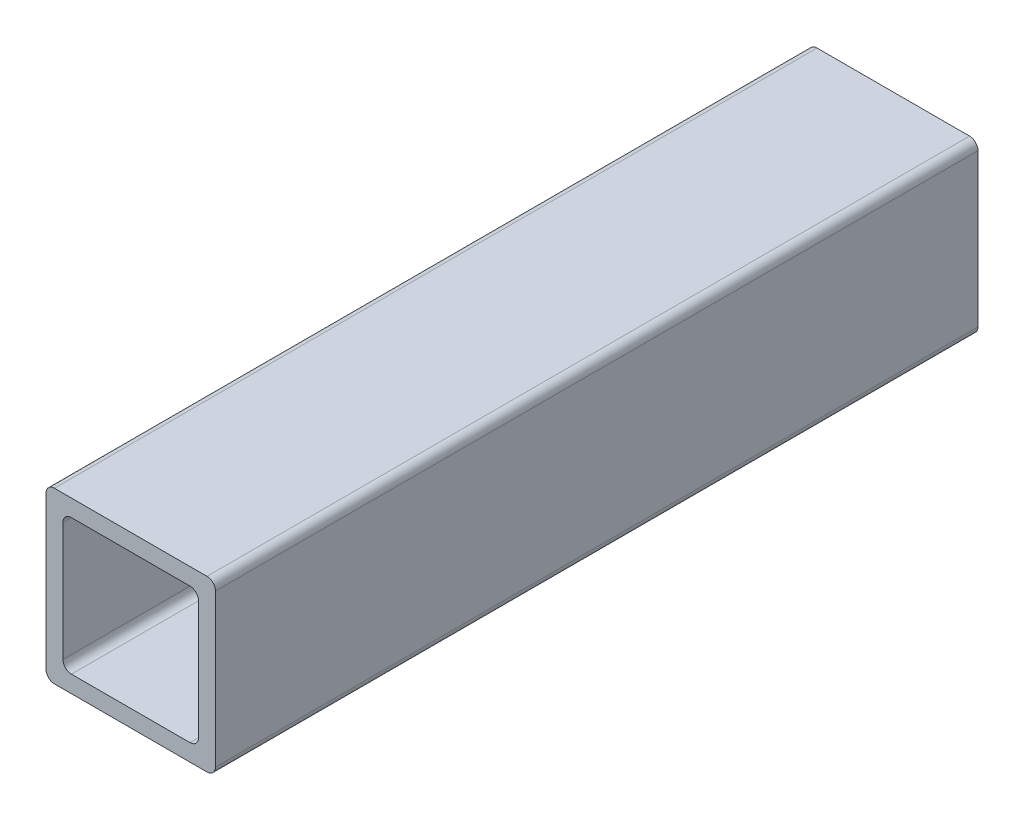
ISO-10303-21;
HEADER;
FILE_DESCRIPTION(('STEP AP214'),'2;1');
FILE_NAME('part.step','',(''),(''),'','','');
FILE_SCHEMA(('AUTOMOTIVE_DESIGN { 1 0 10303 214 1 1 1 1 }'));
ENDSEC;
DATA;
#1=APPLICATION_CONTEXT('core data for automotive mechanical design processes');
#2=APPLICATION_PROTOCOL_DEFINITION('international standard','automotive_design',2000,#1);
#3=PRODUCT_CONTEXT('',#1,'mechanical');
#4=PRODUCT('Part','Part','',(#3));
#5=PRODUCT_RELATED_PRODUCT_CATEGORY('part','',(#4));
#6=PRODUCT_DEFINITION_FORMATION('','',#4);
#7=PRODUCT_DEFINITION_CONTEXT('part definition',#1,'design');
#8=PRODUCT_DEFINITION('design','',#6,#7);
#9=PRODUCT_DEFINITION_SHAPE('','',#8);
#10=(LENGTH_UNIT() NAMED_UNIT(*) SI_UNIT(.MILLI.,.METRE.));
#11=(NAMED_UNIT(*) PLANE_ANGLE_UNIT() SI_UNIT($,.RADIAN.));
#12=(NAMED_UNIT(*) SI_UNIT($,.STERADIAN.) SOLID_ANGLE_UNIT());
#13=UNCERTAINTY_MEASURE_WITH_UNIT(LENGTH_MEASURE(1.E-05),#10,'distance_accuracy_value','');
#14=(GEOMETRIC_REPRESENTATION_CONTEXT(3) GLOBAL_UNCERTAINTY_ASSIGNED_CONTEXT((#13)) GLOBAL_UNIT_ASSIGNED_CONTEXT((#10,
#11,#12)) REPRESENTATION_CONTEXT('',''));
#15=CARTESIAN_POINT('',(0.,0.,0.));
#16=DIRECTION('',(0.,0.,1.));
#17=DIRECTION('',(1.,0.,0.));
#18=AXIS2_PLACEMENT_3D('',#15,#16,#17);
#19=CARTESIAN_POINT('',(2.,2.,180.));
#20=DIRECTION('',(0.,0.,-1.));
#21=DIRECTION('',(-1.,0.,0.));
#22=AXIS2_PLACEMENT_3D('',#19,#20,#21);
#23=PLANE('',#22);
#24=CARTESIAN_POINT('',(2.,2.,180.));
#25=DIRECTION('',(0.,0.,1.));
#26=DIRECTION('',(-1.,0.,0.));
#27=AXIS2_PLACEMENT_3D('',#24,#25,#26);
#28=CIRCLE('',#27,2.);
#29=CARTESIAN_POINT('',(0.,2.00000000000001,180.));
#30=VERTEX_POINT('',#29);
#31=CARTESIAN_POINT('',(2.00000000000001,0.,180.));
#32=VERTEX_POINT('',#31);
#33=EDGE_CURVE('E211',#30,#32,#28,.T.);
#34=ORIENTED_EDGE('',*,*,#33,.T.);
#35=DIRECTION('',(1.,0.,0.));
#36=VECTOR('',#35,1.);
#37=CARTESIAN_POINT('',(2.00000000000001,0.,180.));
#38=LINE('',#37,#36);
#39=CARTESIAN_POINT('',(38.,0.,180.));
#40=VERTEX_POINT('',#39);
#41=EDGE_CURVE('E214',#32,#40,#38,.T.);
#42=ORIENTED_EDGE('',*,*,#41,.T.);
#43=CARTESIAN_POINT('',(38.,2.,180.));
#44=DIRECTION('',(0.,0.,1.));
#45=DIRECTION('',(-1.,0.,0.));
#46=AXIS2_PLACEMENT_3D('',#43,#44,#45);
#47=CIRCLE('',#46,2.);
#48=CARTESIAN_POINT('',(40.,2.00000000000001,180.));
#49=VERTEX_POINT('',#48);
#50=EDGE_CURVE('E217',#40,#49,#47,.T.);
#51=ORIENTED_EDGE('',*,*,#50,.T.);
#52=DIRECTION('',(0.,1.,0.));
#53=VECTOR('',#52,1.);
#54=CARTESIAN_POINT('',(40.,2.00000000000001,180.));
#55=LINE('',#54,#53);
#56=CARTESIAN_POINT('',(40.,38.,180.));
#57=VERTEX_POINT('',#56);
#58=EDGE_CURVE('E219',#49,#57,#55,.T.);
#59=ORIENTED_EDGE('',*,*,#58,.T.);
#60=CARTESIAN_POINT('',(38.,38.,180.));
#61=DIRECTION('',(0.,0.,1.));
#62=DIRECTION('',(-1.,0.,0.));
#63=AXIS2_PLACEMENT_3D('',#60,#61,#62);
#64=CIRCLE('',#63,2.);
#65=CARTESIAN_POINT('',(38.,40.,180.));
#66=VERTEX_POINT('',#65);
#67=EDGE_CURVE('E221',#57,#66,#64,.T.);
#68=ORIENTED_EDGE('',*,*,#67,.T.);
#69=DIRECTION('',(-1.,0.,0.));
#70=VECTOR('',#69,1.);
#71=CARTESIAN_POINT('',(2.00000000000001,40.,180.));
#72=LINE('',#71,#70);
#73=CARTESIAN_POINT('',(2.00000000000001,40.,180.));
#74=VERTEX_POINT('',#73);
#75=EDGE_CURVE('E223',#66,#74,#72,.T.);
#76=ORIENTED_EDGE('',*,*,#75,.T.);
#77=CARTESIAN_POINT('',(2.,38.,180.));
#78=DIRECTION('',(0.,0.,1.));
#79=DIRECTION('',(-1.,0.,0.));
#80=AXIS2_PLACEMENT_3D('',#77,#78,#79);
#81=CIRCLE('',#80,2.);
#82=CARTESIAN_POINT('',(0.,38.,180.));
#83=VERTEX_POINT('',#82);
#84=EDGE_CURVE('E225',#74,#83,#81,.T.);
#85=ORIENTED_EDGE('',*,*,#84,.T.);
#86=DIRECTION('',(0.,-1.,0.));
#87=VECTOR('',#86,1.);
#88=CARTESIAN_POINT('',(0.,2.00000000000001,180.));
#89=LINE('',#88,#87);
#90=EDGE_CURVE('E227',#83,#30,#89,.T.);
#91=ORIENTED_EDGE('',*,*,#90,.T.);
#92=EDGE_LOOP('',(#34,#42,#51,#59,#68,#76,#85,#91));
#93=FACE_BOUND('',#92,.T.);
#94=CARTESIAN_POINT('',(34.,6.,180.));
#95=DIRECTION('',(0.,0.,1.));
#96=DIRECTION('',(1.,0.,0.));
#97=AXIS2_PLACEMENT_3D('',#94,#95,#96);
#98=CIRCLE('',#97,2.);
#99=CARTESIAN_POINT('',(34.,4.,180.));
#100=VERTEX_POINT('',#99);
#101=CARTESIAN_POINT('',(36.,6.00000000000001,180.));
#102=VERTEX_POINT('',#101);
#103=EDGE_CURVE('E146',#100,#102,#98,.T.);
#104=ORIENTED_EDGE('',*,*,#103,.F.);
#105=DIRECTION('',(1.,0.,0.));
#106=VECTOR('',#105,1.);
#107=CARTESIAN_POINT('',(6.00000000000001,4.,180.));
#108=LINE('',#107,#106);
#109=CARTESIAN_POINT('',(6.00000000000001,4.,180.));
#110=VERTEX_POINT('',#109);
#111=EDGE_CURVE('E179',#110,#100,#108,.T.);
#112=ORIENTED_EDGE('',*,*,#111,.F.);
#113=CARTESIAN_POINT('',(6.,6.,180.));
#114=DIRECTION('',(0.,0.,1.));
#115=DIRECTION('',(1.,0.,0.));
#116=AXIS2_PLACEMENT_3D('',#113,#114,#115);
#117=CIRCLE('',#116,2.);
#118=CARTESIAN_POINT('',(4.,6.00000000000001,180.));
#119=VERTEX_POINT('',#118);
#120=EDGE_CURVE('E177',#119,#110,#117,.T.);
#121=ORIENTED_EDGE('',*,*,#120,.F.);
#122=DIRECTION('',(0.,-1.,0.));
#123=VECTOR('',#122,1.);
#124=CARTESIAN_POINT('',(4.,6.00000000000001,180.));
#125=LINE('',#124,#123);
#126=CARTESIAN_POINT('',(4.,34.,180.));
#127=VERTEX_POINT('',#126);
#128=EDGE_CURVE('E175',#127,#119,#125,.T.);
#129=ORIENTED_EDGE('',*,*,#128,.F.);
#130=CARTESIAN_POINT('',(6.,34.,180.));
#131=DIRECTION('',(0.,0.,1.));
#132=DIRECTION('',(1.,0.,0.));
#133=AXIS2_PLACEMENT_3D('',#130,#131,#132);
#134=CIRCLE('',#133,2.);
#135=CARTESIAN_POINT('',(6.00000000000001,36.,180.));
#136=VERTEX_POINT('',#135);
#137=EDGE_CURVE('E173',#136,#127,#134,.T.);
#138=ORIENTED_EDGE('',*,*,#137,.F.);
#139=DIRECTION('',(-1.,0.,0.));
#140=VECTOR('',#139,1.);
#141=CARTESIAN_POINT('',(6.00000000000001,36.,180.));
#142=LINE('',#141,#140);
#143=CARTESIAN_POINT('',(34.,36.,180.));
#144=VERTEX_POINT('',#143);
#145=EDGE_CURVE('E169',#144,#136,#142,.T.);
#146=ORIENTED_EDGE('',*,*,#145,.F.);
#147=CARTESIAN_POINT('',(34.,34.,180.));
#148=DIRECTION('',(0.,0.,1.));
#149=DIRECTION('',(1.,0.,0.));
#150=AXIS2_PLACEMENT_3D('',#147,#148,#149);
#151=CIRCLE('',#150,2.);
#152=CARTESIAN_POINT('',(36.,34.,180.));
#153=VERTEX_POINT('',#152);
#154=EDGE_CURVE('E167',#153,#144,#151,.T.);
#155=ORIENTED_EDGE('',*,*,#154,.F.);
#156=DIRECTION('',(0.,1.,0.));
#157=VECTOR('',#156,1.);
#158=CARTESIAN_POINT('',(36.,6.00000000000001,180.));
#159=LINE('',#158,#157);
#160=EDGE_CURVE('E154',#102,#153,#159,.T.);
#161=ORIENTED_EDGE('',*,*,#160,.F.);
#162=EDGE_LOOP('',(#104,#112,#121,#129,#138,#146,#155,#161));
#163=FACE_BOUND('',#162,.T.);
#164=ADVANCED_FACE('F33',(#93,#163),#23,.F.);
#165=CARTESIAN_POINT('',(2.,2.,0.));
#166=DIRECTION('',(0.,0.,-1.));
#167=DIRECTION('',(-1.,0.,0.));
#168=AXIS2_PLACEMENT_3D('',#165,#166,#167);
#169=PLANE('',#168);
#170=CARTESIAN_POINT('',(2.,2.,0.));
#171=DIRECTION('',(0.,0.,1.));
#172=DIRECTION('',(-1.,0.,0.));
#173=AXIS2_PLACEMENT_3D('',#170,#171,#172);
#174=CIRCLE('',#173,2.);
#175=CARTESIAN_POINT('',(0.,2.00000000000001,0.));
#176=VERTEX_POINT('',#175);
#177=CARTESIAN_POINT('',(2.00000000000001,0.,0.));
#178=VERTEX_POINT('',#177);
#179=EDGE_CURVE('E162',#176,#178,#174,.T.);
#180=ORIENTED_EDGE('',*,*,#179,.F.);
#181=DIRECTION('',(0.,-1.,0.));
#182=VECTOR('',#181,1.);
#183=CARTESIAN_POINT('',(0.,2.00000000000001,0.));
#184=LINE('',#183,#182);
#185=CARTESIAN_POINT('',(0.,38.,0.));
#186=VERTEX_POINT('',#185);
#187=EDGE_CURVE('E215',#186,#176,#184,.T.);
#188=ORIENTED_EDGE('',*,*,#187,.F.);
#189=CARTESIAN_POINT('',(2.,38.,0.));
#190=DIRECTION('',(0.,0.,1.));
#191=DIRECTION('',(-1.,0.,0.));
#192=AXIS2_PLACEMENT_3D('',#189,#190,#191);
#193=CIRCLE('',#192,2.);
#194=CARTESIAN_POINT('',(2.00000000000001,40.,0.));
#195=VERTEX_POINT('',#194);
#196=EDGE_CURVE('E242',#195,#186,#193,.T.);
#197=ORIENTED_EDGE('',*,*,#196,.F.);
#198=DIRECTION('',(-1.,0.,0.));
#199=VECTOR('',#198,1.);
#200=CARTESIAN_POINT('',(2.00000000000001,40.,0.));
#201=LINE('',#200,#199);
#202=CARTESIAN_POINT('',(38.,40.,0.));
#203=VERTEX_POINT('',#202);
#204=EDGE_CURVE('E240',#203,#195,#201,.T.);
#205=ORIENTED_EDGE('',*,*,#204,.F.);
#206=CARTESIAN_POINT('',(38.,38.,0.));
#207=DIRECTION('',(0.,0.,1.));
#208=DIRECTION('',(-1.,0.,0.));
#209=AXIS2_PLACEMENT_3D('',#206,#207,#208);
#210=CIRCLE('',#209,2.);
#211=CARTESIAN_POINT('',(40.,38.,0.));
#212=VERTEX_POINT('',#211);
#213=EDGE_CURVE('E238',#212,#203,#210,.T.);
#214=ORIENTED_EDGE('',*,*,#213,.F.);
#215=DIRECTION('',(0.,1.,0.));
#216=VECTOR('',#215,1.);
#217=CARTESIAN_POINT('',(40.,2.00000000000001,0.));
#218=LINE('',#217,#216);
#219=CARTESIAN_POINT('',(40.,2.00000000000001,0.));
#220=VERTEX_POINT('',#219);
#221=EDGE_CURVE('E236',#220,#212,#218,.T.);
#222=ORIENTED_EDGE('',*,*,#221,.F.);
#223=CARTESIAN_POINT('',(38.,2.,0.));
#224=DIRECTION('',(0.,0.,1.));
#225=DIRECTION('',(-1.,0.,0.));
#226=AXIS2_PLACEMENT_3D('',#223,#224,#225);
#227=CIRCLE('',#226,2.);
#228=CARTESIAN_POINT('',(38.,0.,0.));
#229=VERTEX_POINT('',#228);
#230=EDGE_CURVE('E234',#229,#220,#227,.T.);
#231=ORIENTED_EDGE('',*,*,#230,.F.);
#232=DIRECTION('',(1.,0.,0.));
#233=VECTOR('',#232,1.);
#234=CARTESIAN_POINT('',(2.00000000000001,0.,0.));
#235=LINE('',#234,#233);
#236=EDGE_CURVE('E232',#178,#229,#235,.T.);
#237=ORIENTED_EDGE('',*,*,#236,.F.);
#238=EDGE_LOOP('',(#180,#188,#197,#205,#214,#222,#231,#237));
#239=FACE_BOUND('',#238,.T.);
#240=DIRECTION('',(1.,0.,0.));
#241=VECTOR('',#240,1.);
#242=CARTESIAN_POINT('',(6.00000000000001,4.,0.));
#243=LINE('',#242,#241);
#244=CARTESIAN_POINT('',(6.00000000000001,4.,0.));
#245=VERTEX_POINT('',#244);
#246=CARTESIAN_POINT('',(34.,4.,0.));
#247=VERTEX_POINT('',#246);
#248=EDGE_CURVE('E155',#245,#247,#243,.T.);
#249=ORIENTED_EDGE('',*,*,#248,.T.);
#250=CARTESIAN_POINT('',(34.,6.,0.));
#251=DIRECTION('',(0.,0.,1.));
#252=DIRECTION('',(1.,0.,0.));
#253=AXIS2_PLACEMENT_3D('',#250,#251,#252);
#254=CIRCLE('',#253,2.);
#255=CARTESIAN_POINT('',(36.,6.00000000000001,0.));
#256=VERTEX_POINT('',#255);
#257=EDGE_CURVE('E56',#247,#256,#254,.T.);
#258=ORIENTED_EDGE('',*,*,#257,.T.);
#259=DIRECTION('',(0.,1.,0.));
#260=VECTOR('',#259,1.);
#261=CARTESIAN_POINT('',(36.,6.00000000000001,0.));
#262=LINE('',#261,#260);
#263=CARTESIAN_POINT('',(36.,34.,0.));
#264=VERTEX_POINT('',#263);
#265=EDGE_CURVE('E161',#256,#264,#262,.T.);
#266=ORIENTED_EDGE('',*,*,#265,.T.);
#267=CARTESIAN_POINT('',(34.,34.,0.));
#268=DIRECTION('',(0.,0.,1.));
#269=DIRECTION('',(1.,0.,0.));
#270=AXIS2_PLACEMENT_3D('',#267,#268,#269);
#271=CIRCLE('',#270,2.);
#272=CARTESIAN_POINT('',(34.,36.,0.));
#273=VERTEX_POINT('',#272);
#274=EDGE_CURVE('E183',#264,#273,#271,.T.);
#275=ORIENTED_EDGE('',*,*,#274,.T.);
#276=DIRECTION('',(-1.,0.,0.));
#277=VECTOR('',#276,1.);
#278=CARTESIAN_POINT('',(6.00000000000001,36.,0.));
#279=LINE('',#278,#277);
#280=CARTESIAN_POINT('',(6.00000000000001,36.,0.));
#281=VERTEX_POINT('',#280);
#282=EDGE_CURVE('E186',#273,#281,#279,.T.);
#283=ORIENTED_EDGE('',*,*,#282,.T.);
#284=CARTESIAN_POINT('',(6.,34.,0.));
#285=DIRECTION('',(0.,0.,1.));
#286=DIRECTION('',(1.,0.,0.));
#287=AXIS2_PLACEMENT_3D('',#284,#285,#286);
#288=CIRCLE('',#287,2.);
#289=CARTESIAN_POINT('',(4.,34.,0.));
#290=VERTEX_POINT('',#289);
#291=EDGE_CURVE('E189',#281,#290,#288,.T.);
#292=ORIENTED_EDGE('',*,*,#291,.T.);
#293=DIRECTION('',(0.,-1.,0.));
#294=VECTOR('',#293,1.);
#295=CARTESIAN_POINT('',(4.,6.00000000000001,0.));
#296=LINE('',#295,#294);
#297=CARTESIAN_POINT('',(4.,6.00000000000001,0.));
#298=VERTEX_POINT('',#297);
#299=EDGE_CURVE('E192',#290,#298,#296,.T.);
#300=ORIENTED_EDGE('',*,*,#299,.T.);
#301=CARTESIAN_POINT('',(6.,6.,0.));
#302=DIRECTION('',(0.,0.,1.));
#303=DIRECTION('',(1.,0.,0.));
#304=AXIS2_PLACEMENT_3D('',#301,#302,#303);
#305=CIRCLE('',#304,2.);
#306=EDGE_CURVE('E195',#298,#245,#305,.T.);
#307=ORIENTED_EDGE('',*,*,#306,.T.);
#308=EDGE_LOOP('',(#249,#258,#266,#275,#283,#292,#300,#307));
#309=FACE_BOUND('',#308,.T.);
#310=ADVANCED_FACE('F272',(#239,#309),#169,.T.);
#311=CARTESIAN_POINT('',(2.,2.,180.));
#312=DIRECTION('',(0.,0.,-1.));
#313=DIRECTION('',(-1.,0.,0.));
#314=AXIS2_PLACEMENT_3D('',#311,#312,#313);
#315=CYLINDRICAL_SURFACE('',#314,2.);
#316=ORIENTED_EDGE('',*,*,#179,.T.);
#317=DIRECTION('',(0.,0.,-1.));
#318=VECTOR('',#317,1.);
#319=CARTESIAN_POINT('',(2.00000000000001,0.,180.));
#320=LINE('',#319,#318);
#321=EDGE_CURVE('E11',#32,#178,#320,.T.);
#322=ORIENTED_EDGE('',*,*,#321,.F.);
#323=ORIENTED_EDGE('',*,*,#33,.F.);
#324=DIRECTION('',(0.,0.,-1.));
#325=VECTOR('',#324,1.);
#326=CARTESIAN_POINT('',(0.,2.00000000000001,180.));
#327=LINE('',#326,#325);
#328=EDGE_CURVE('E229',#30,#176,#327,.T.);
#329=ORIENTED_EDGE('',*,*,#328,.T.);
#330=EDGE_LOOP('',(#316,#322,#323,#329));
#331=FACE_BOUND('',#330,.T.);
#332=ADVANCED_FACE('F35',(#331),#315,.T.);
#333=CARTESIAN_POINT('',(2.00000000000001,0.,180.));
#334=DIRECTION('',(0.,1.,0.));
#335=DIRECTION('',(0.,0.,1.));
#336=AXIS2_PLACEMENT_3D('',#333,#334,#335);
#337=PLANE('',#336);
#338=ORIENTED_EDGE('',*,*,#236,.T.);
#339=DIRECTION('',(0.,0.,-1.));
#340=VECTOR('',#339,1.);
#341=CARTESIAN_POINT('',(38.,0.,180.));
#342=LINE('',#341,#340);
#343=EDGE_CURVE('E41',#40,#229,#342,.T.);
#344=ORIENTED_EDGE('',*,*,#343,.F.);
#345=ORIENTED_EDGE('',*,*,#41,.F.);
#346=ORIENTED_EDGE('',*,*,#321,.T.);
#347=EDGE_LOOP('',(#338,#344,#345,#346));
#348=FACE_BOUND('',#347,.T.);
#349=ADVANCED_FACE('F289',(#348),#337,.F.);
#350=CARTESIAN_POINT('',(38.,2.,180.));
#351=DIRECTION('',(0.,0.,-1.));
#352=DIRECTION('',(-1.,0.,0.));
#353=AXIS2_PLACEMENT_3D('',#350,#351,#352);
#354=CYLINDRICAL_SURFACE('',#353,2.);
#355=ORIENTED_EDGE('',*,*,#230,.T.);
#356=DIRECTION('',(0.,0.,-1.));
#357=VECTOR('',#356,1.);
#358=CARTESIAN_POINT('',(40.,2.00000000000001,180.));
#359=LINE('',#358,#357);
#360=EDGE_CURVE('E259',#49,#220,#359,.T.);
#361=ORIENTED_EDGE('',*,*,#360,.F.);
#362=ORIENTED_EDGE('',*,*,#50,.F.);
#363=ORIENTED_EDGE('',*,*,#343,.T.);
#364=EDGE_LOOP('',(#355,#361,#362,#363));
#365=FACE_BOUND('',#364,.T.);
#366=ADVANCED_FACE('F266',(#365),#354,.T.);
#367=CARTESIAN_POINT('',(40.,2.00000000000001,180.));
#368=DIRECTION('',(-1.,0.,0.));
#369=DIRECTION('',(0.,0.,1.));
#370=AXIS2_PLACEMENT_3D('',#367,#368,#369);
#371=PLANE('',#370);
#372=ORIENTED_EDGE('',*,*,#221,.T.);
#373=DIRECTION('',(0.,0.,-1.));
#374=VECTOR('',#373,1.);
#375=CARTESIAN_POINT('',(40.,38.,180.));
#376=LINE('',#375,#374);
#377=EDGE_CURVE('E256',#57,#212,#376,.T.);
#378=ORIENTED_EDGE('',*,*,#377,.F.);
#379=ORIENTED_EDGE('',*,*,#58,.F.);
#380=ORIENTED_EDGE('',*,*,#360,.T.);
#381=EDGE_LOOP('',(#372,#378,#379,#380));
#382=FACE_BOUND('',#381,.T.);
#383=ADVANCED_FACE('F278',(#382),#371,.F.);
#384=CARTESIAN_POINT('',(38.,38.,180.));
#385=DIRECTION('',(0.,0.,-1.));
#386=DIRECTION('',(-1.,0.,0.));
#387=AXIS2_PLACEMENT_3D('',#384,#385,#386);
#388=CYLINDRICAL_SURFACE('',#387,2.);
#389=ORIENTED_EDGE('',*,*,#213,.T.);
#390=DIRECTION('',(0.,0.,-1.));
#391=VECTOR('',#390,1.);
#392=CARTESIAN_POINT('',(38.,40.,180.));
#393=LINE('',#392,#391);
#394=EDGE_CURVE('E253',#66,#203,#393,.T.);
#395=ORIENTED_EDGE('',*,*,#394,.F.);
#396=ORIENTED_EDGE('',*,*,#67,.F.);
#397=ORIENTED_EDGE('',*,*,#377,.T.);
#398=EDGE_LOOP('',(#389,#395,#396,#397));
#399=FACE_BOUND('',#398,.T.);
#400=ADVANCED_FACE('F282',(#399),#388,.T.);
#401=CARTESIAN_POINT('',(2.00000000000001,40.,180.));
#402=DIRECTION('',(0.,-1.,0.));
#403=DIRECTION('',(0.,0.,-1.));
#404=AXIS2_PLACEMENT_3D('',#401,#402,#403);
#405=PLANE('',#404);
#406=ORIENTED_EDGE('',*,*,#204,.T.);
#407=DIRECTION('',(0.,0.,-1.));
#408=VECTOR('',#407,1.);
#409=CARTESIAN_POINT('',(2.00000000000001,40.,180.));
#410=LINE('',#409,#408);
#411=EDGE_CURVE('E250',#74,#195,#410,.T.);
#412=ORIENTED_EDGE('',*,*,#411,.F.);
#413=ORIENTED_EDGE('',*,*,#75,.F.);
#414=ORIENTED_EDGE('',*,*,#394,.T.);
#415=EDGE_LOOP('',(#406,#412,#413,#414));
#416=FACE_BOUND('',#415,.T.);
#417=ADVANCED_FACE('F302',(#416),#405,.F.);
#418=CARTESIAN_POINT('',(2.,38.,180.));
#419=DIRECTION('',(0.,0.,-1.));
#420=DIRECTION('',(-1.,0.,0.));
#421=AXIS2_PLACEMENT_3D('',#418,#419,#420);
#422=CYLINDRICAL_SURFACE('',#421,2.);
#423=ORIENTED_EDGE('',*,*,#196,.T.);
#424=DIRECTION('',(0.,0.,-1.));
#425=VECTOR('',#424,1.);
#426=CARTESIAN_POINT('',(0.,38.,180.));
#427=LINE('',#426,#425);
#428=EDGE_CURVE('E247',#83,#186,#427,.T.);
#429=ORIENTED_EDGE('',*,*,#428,.F.);
#430=ORIENTED_EDGE('',*,*,#84,.F.);
#431=ORIENTED_EDGE('',*,*,#411,.T.);
#432=EDGE_LOOP('',(#423,#429,#430,#431));
#433=FACE_BOUND('',#432,.T.);
#434=ADVANCED_FACE('F300',(#433),#422,.T.);
#435=CARTESIAN_POINT('',(0.,2.00000000000001,180.));
#436=DIRECTION('',(1.,0.,0.));
#437=DIRECTION('',(0.,0.,-1.));
#438=AXIS2_PLACEMENT_3D('',#435,#436,#437);
#439=PLANE('',#438);
#440=ORIENTED_EDGE('',*,*,#187,.T.);
#441=ORIENTED_EDGE('',*,*,#328,.F.);
#442=ORIENTED_EDGE('',*,*,#90,.F.);
#443=ORIENTED_EDGE('',*,*,#428,.T.);
#444=EDGE_LOOP('',(#440,#441,#442,#443));
#445=FACE_BOUND('',#444,.T.);
#446=ADVANCED_FACE('F295',(#445),#439,.F.);
#447=CARTESIAN_POINT('',(34.,6.,180.));
#448=DIRECTION('',(0.,0.,-1.));
#449=DIRECTION('',(-1.,0.,0.));
#450=AXIS2_PLACEMENT_3D('',#447,#448,#449);
#451=CYLINDRICAL_SURFACE('',#450,2.);
#452=ORIENTED_EDGE('',*,*,#257,.F.);
#453=DIRECTION('',(0.,0.,-1.));
#454=VECTOR('',#453,1.);
#455=CARTESIAN_POINT('',(34.,4.,180.));
#456=LINE('',#455,#454);
#457=EDGE_CURVE('E150',#100,#247,#456,.T.);
#458=ORIENTED_EDGE('',*,*,#457,.F.);
#459=ORIENTED_EDGE('',*,*,#103,.T.);
#460=DIRECTION('',(0.,0.,-1.));
#461=VECTOR('',#460,1.);
#462=CARTESIAN_POINT('',(36.,6.00000000000001,180.));
#463=LINE('',#462,#461);
#464=EDGE_CURVE('E149',#102,#256,#463,.T.);
#465=ORIENTED_EDGE('',*,*,#464,.T.);
#466=EDGE_LOOP('',(#452,#458,#459,#465));
#467=FACE_BOUND('',#466,.T.);
#468=ADVANCED_FACE('F148',(#467),#451,.F.);
#469=CARTESIAN_POINT('',(36.,6.00000000000001,180.));
#470=DIRECTION('',(-1.,0.,0.));
#471=DIRECTION('',(0.,0.,1.));
#472=AXIS2_PLACEMENT_3D('',#469,#470,#471);
#473=PLANE('',#472);
#474=ORIENTED_EDGE('',*,*,#265,.F.);
#475=ORIENTED_EDGE('',*,*,#464,.F.);
#476=ORIENTED_EDGE('',*,*,#160,.T.);
#477=DIRECTION('',(0.,0.,-1.));
#478=VECTOR('',#477,1.);
#479=CARTESIAN_POINT('',(36.,34.,180.));
#480=LINE('',#479,#478);
#481=EDGE_CURVE('E163',#153,#264,#480,.T.);
#482=ORIENTED_EDGE('',*,*,#481,.T.);
#483=EDGE_LOOP('',(#474,#475,#476,#482));
#484=FACE_BOUND('',#483,.T.);
#485=ADVANCED_FACE('F158',(#484),#473,.T.);
#486=CARTESIAN_POINT('',(34.,34.,180.));
#487=DIRECTION('',(0.,0.,-1.));
#488=DIRECTION('',(-1.,0.,0.));
#489=AXIS2_PLACEMENT_3D('',#486,#487,#488);
#490=CYLINDRICAL_SURFACE('',#489,2.);
#491=ORIENTED_EDGE('',*,*,#274,.F.);
#492=ORIENTED_EDGE('',*,*,#481,.F.);
#493=ORIENTED_EDGE('',*,*,#154,.T.);
#494=DIRECTION('',(0.,0.,-1.));
#495=VECTOR('',#494,1.);
#496=CARTESIAN_POINT('',(34.,36.,180.));
#497=LINE('',#496,#495);
#498=EDGE_CURVE('E208',#144,#273,#497,.T.);
#499=ORIENTED_EDGE('',*,*,#498,.T.);
#500=EDGE_LOOP('',(#491,#492,#493,#499));
#501=FACE_BOUND('',#500,.T.);
#502=ADVANCED_FACE('F327',(#501),#490,.F.);
#503=CARTESIAN_POINT('',(6.00000000000001,36.,180.));
#504=DIRECTION('',(0.,-1.,0.));
#505=DIRECTION('',(0.,0.,-1.));
#506=AXIS2_PLACEMENT_3D('',#503,#504,#505);
#507=PLANE('',#506);
#508=ORIENTED_EDGE('',*,*,#282,.F.);
#509=ORIENTED_EDGE('',*,*,#498,.F.);
#510=ORIENTED_EDGE('',*,*,#145,.T.);
#511=DIRECTION('',(0.,0.,-1.));
#512=VECTOR('',#511,1.);
#513=CARTESIAN_POINT('',(6.00000000000001,36.,180.));
#514=LINE('',#513,#512);
#515=EDGE_CURVE('E206',#136,#281,#514,.T.);
#516=ORIENTED_EDGE('',*,*,#515,.T.);
#517=EDGE_LOOP('',(#508,#509,#510,#516));
#518=FACE_BOUND('',#517,.T.);
#519=ADVANCED_FACE('F331',(#518),#507,.T.);
#520=CARTESIAN_POINT('',(6.,34.,180.));
#521=DIRECTION('',(0.,0.,-1.));
#522=DIRECTION('',(-1.,0.,0.));
#523=AXIS2_PLACEMENT_3D('',#520,#521,#522);
#524=CYLINDRICAL_SURFACE('',#523,2.);
#525=ORIENTED_EDGE('',*,*,#291,.F.);
#526=ORIENTED_EDGE('',*,*,#515,.F.);
#527=ORIENTED_EDGE('',*,*,#137,.T.);
#528=DIRECTION('',(0.,0.,-1.));
#529=VECTOR('',#528,1.);
#530=CARTESIAN_POINT('',(4.,34.,180.));
#531=LINE('',#530,#529);
#532=EDGE_CURVE('E204',#127,#290,#531,.T.);
#533=ORIENTED_EDGE('',*,*,#532,.T.);
#534=EDGE_LOOP('',(#525,#526,#527,#533));
#535=FACE_BOUND('',#534,.T.);
#536=ADVANCED_FACE('F337',(#535),#524,.F.);
#537=CARTESIAN_POINT('',(4.,6.00000000000001,180.));
#538=DIRECTION('',(1.,0.,0.));
#539=DIRECTION('',(0.,0.,-1.));
#540=AXIS2_PLACEMENT_3D('',#537,#538,#539);
#541=PLANE('',#540);
#542=ORIENTED_EDGE('',*,*,#299,.F.);
#543=ORIENTED_EDGE('',*,*,#532,.F.);
#544=ORIENTED_EDGE('',*,*,#128,.T.);
#545=DIRECTION('',(0.,0.,-1.));
#546=VECTOR('',#545,1.);
#547=CARTESIAN_POINT('',(4.,6.00000000000001,180.));
#548=LINE('',#547,#546);
#549=EDGE_CURVE('E202',#119,#298,#548,.T.);
#550=ORIENTED_EDGE('',*,*,#549,.T.);
#551=EDGE_LOOP('',(#542,#543,#544,#550));
#552=FACE_BOUND('',#551,.T.);
#553=ADVANCED_FACE('F341',(#552),#541,.T.);
#554=CARTESIAN_POINT('',(6.,6.,180.));
#555=DIRECTION('',(0.,0.,-1.));
#556=DIRECTION('',(-1.,0.,0.));
#557=AXIS2_PLACEMENT_3D('',#554,#555,#556);
#558=CYLINDRICAL_SURFACE('',#557,2.);
#559=ORIENTED_EDGE('',*,*,#306,.F.);
#560=ORIENTED_EDGE('',*,*,#549,.F.);
#561=ORIENTED_EDGE('',*,*,#120,.T.);
#562=DIRECTION('',(0.,0.,-1.));
#563=VECTOR('',#562,1.);
#564=CARTESIAN_POINT('',(6.00000000000001,4.,180.));
#565=LINE('',#564,#563);
#566=EDGE_CURVE('E48',#110,#245,#565,.T.);
#567=ORIENTED_EDGE('',*,*,#566,.T.);
#568=EDGE_LOOP('',(#559,#560,#561,#567));
#569=FACE_BOUND('',#568,.T.);
#570=ADVANCED_FACE('F345',(#569),#558,.F.);
#571=CARTESIAN_POINT('',(6.00000000000001,4.,180.));
#572=DIRECTION('',(0.,1.,0.));
#573=DIRECTION('',(0.,0.,1.));
#574=AXIS2_PLACEMENT_3D('',#571,#572,#573);
#575=PLANE('',#574);
#576=ORIENTED_EDGE('',*,*,#248,.F.);
#577=ORIENTED_EDGE('',*,*,#566,.F.);
#578=ORIENTED_EDGE('',*,*,#111,.T.);
#579=ORIENTED_EDGE('',*,*,#457,.T.);
#580=EDGE_LOOP('',(#576,#577,#578,#579));
#581=FACE_BOUND('',#580,.T.);
#582=ADVANCED_FACE('F349',(#581),#575,.T.);
#583=CLOSED_SHELL('',(#164,#310,#332,#349,#366,#383,#400,#417,#434,#446,#468,#485,#502,#519,
#536,#553,#570,#582));
#584=MANIFOLD_SOLID_BREP('B2',#583);
#585=ADVANCED_BREP_SHAPE_REPRESENTATION('',(#18,#584),#14);
#586=SHAPE_DEFINITION_REPRESENTATION(#9,#585);
ENDSEC;
END-ISO-10303-21;
